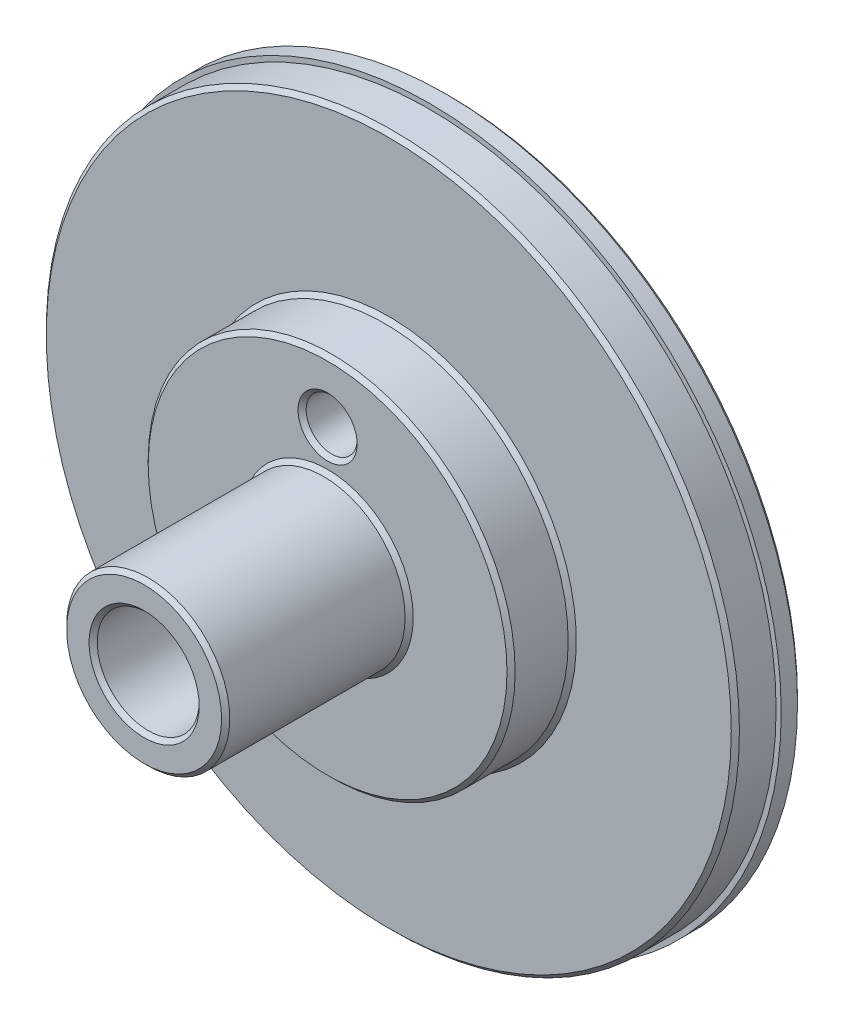
ISO-10303-21;
HEADER;
FILE_DESCRIPTION(('STEP AP214'),'2;1');
FILE_NAME('part.step','',(''),(''),'','','');
FILE_SCHEMA(('AUTOMOTIVE_DESIGN { 1 0 10303 214 1 1 1 1 }'));
ENDSEC;
DATA;
#1=APPLICATION_CONTEXT('core data for automotive mechanical design processes');
#2=APPLICATION_PROTOCOL_DEFINITION('international standard','automotive_design',2000,#1);
#3=PRODUCT_CONTEXT('',#1,'mechanical');
#4=PRODUCT('Part','Part','',(#3));
#5=PRODUCT_RELATED_PRODUCT_CATEGORY('part','',(#4));
#6=PRODUCT_DEFINITION_FORMATION('','',#4);
#7=PRODUCT_DEFINITION_CONTEXT('part definition',#1,'design');
#8=PRODUCT_DEFINITION('design','',#6,#7);
#9=PRODUCT_DEFINITION_SHAPE('','',#8);
#10=(LENGTH_UNIT() NAMED_UNIT(*) SI_UNIT(.MILLI.,.METRE.));
#11=(NAMED_UNIT(*) PLANE_ANGLE_UNIT() SI_UNIT($,.RADIAN.));
#12=(NAMED_UNIT(*) SI_UNIT($,.STERADIAN.) SOLID_ANGLE_UNIT());
#13=UNCERTAINTY_MEASURE_WITH_UNIT(LENGTH_MEASURE(1.E-05),#10,'distance_accuracy_value','');
#14=(GEOMETRIC_REPRESENTATION_CONTEXT(3) GLOBAL_UNCERTAINTY_ASSIGNED_CONTEXT((#13)) GLOBAL_UNIT_ASSIGNED_CONTEXT((#10,
#11,#12)) REPRESENTATION_CONTEXT('',''));
#15=CARTESIAN_POINT('',(0.,0.,0.));
#16=DIRECTION('',(0.,0.,1.));
#17=DIRECTION('',(1.,0.,0.));
#18=AXIS2_PLACEMENT_3D('',#15,#16,#17);
#19=CARTESIAN_POINT('',(0.,0.,1.));
#20=DIRECTION('',(0.,0.,-1.));
#21=DIRECTION('',(-1.,0.,0.));
#22=AXIS2_PLACEMENT_3D('',#19,#20,#21);
#23=CYLINDRICAL_SURFACE('',#22,17.25);
#24=CARTESIAN_POINT('',(0.,0.,0.199999999999992));
#25=DIRECTION('',(0.,0.,1.));
#26=DIRECTION('',(1.,0.,0.));
#27=AXIS2_PLACEMENT_3D('',#24,#25,#26);
#28=CIRCLE('',#27,17.25);
#29=CARTESIAN_POINT('',(17.25,0.,0.199999999999992));
#30=VERTEX_POINT('',#29);
#31=EDGE_CURVE('E126',#30,#30,#28,.T.);
#32=ORIENTED_EDGE('',*,*,#31,.T.);
#33=EDGE_LOOP('',(#32));
#34=FACE_BOUND('',#33,.T.);
#35=CARTESIAN_POINT('',(0.,0.,1.));
#36=DIRECTION('',(0.,0.,1.));
#37=DIRECTION('',(1.,0.,0.));
#38=AXIS2_PLACEMENT_3D('',#35,#36,#37);
#39=CIRCLE('',#38,17.25);
#40=CARTESIAN_POINT('',(17.25,0.,1.));
#41=VERTEX_POINT('',#40);
#42=EDGE_CURVE('E130',#41,#41,#39,.T.);
#43=ORIENTED_EDGE('',*,*,#42,.F.);
#44=EDGE_LOOP('',(#43));
#45=FACE_BOUND('',#44,.T.);
#46=ADVANCED_FACE('F41',(#34,#45),#23,.T.);
#47=CARTESIAN_POINT('',(0.,0.,1.));
#48=DIRECTION('',(0.,0.,1.));
#49=DIRECTION('',(1.,0.,0.));
#50=AXIS2_PLACEMENT_3D('',#47,#48,#49);
#51=PLANE('',#50);
#52=CARTESIAN_POINT('',(0.,0.,1.));
#53=DIRECTION('',(0.,0.,1.));
#54=DIRECTION('',(1.,0.,0.));
#55=AXIS2_PLACEMENT_3D('',#52,#53,#54);
#56=CIRCLE('',#55,17.);
#57=CARTESIAN_POINT('',(17.,0.,1.));
#58=VERTEX_POINT('',#57);
#59=EDGE_CURVE('E134',#58,#58,#56,.T.);
#60=ORIENTED_EDGE('',*,*,#59,.F.);
#61=EDGE_LOOP('',(#60));
#62=FACE_BOUND('',#61,.T.);
#63=ORIENTED_EDGE('',*,*,#42,.T.);
#64=EDGE_LOOP('',(#63));
#65=FACE_BOUND('',#64,.T.);
#66=ADVANCED_FACE('F141',(#62,#65),#51,.T.);
#67=CARTESIAN_POINT('',(0.,0.,0.));
#68=DIRECTION('',(0.,0.,1.));
#69=DIRECTION('',(1.,0.,0.));
#70=AXIS2_PLACEMENT_3D('',#67,#68,#69);
#71=PLANE('',#70);
#72=CARTESIAN_POINT('',(0.,0.,0.));
#73=DIRECTION('',(0.,0.,1.));
#74=DIRECTION('',(1.,0.,0.));
#75=AXIS2_PLACEMENT_3D('',#72,#73,#74);
#76=CIRCLE('',#75,17.05);
#77=CARTESIAN_POINT('',(17.05,0.,0.));
#78=VERTEX_POINT('',#77);
#79=EDGE_CURVE('E114',#78,#78,#76,.F.);
#80=ORIENTED_EDGE('',*,*,#79,.T.);
#81=EDGE_LOOP('',(#80));
#82=FACE_BOUND('',#81,.T.);
#83=CARTESIAN_POINT('',(0.,0.,0.));
#84=DIRECTION('',(0.,0.,1.));
#85=DIRECTION('',(1.,0.,0.));
#86=AXIS2_PLACEMENT_3D('',#83,#84,#85);
#87=CIRCLE('',#86,2.7);
#88=CARTESIAN_POINT('',(2.7,0.,0.));
#89=VERTEX_POINT('',#88);
#90=EDGE_CURVE('E118',#89,#89,#87,.T.);
#91=ORIENTED_EDGE('',*,*,#90,.T.);
#92=EDGE_LOOP('',(#91));
#93=FACE_BOUND('',#92,.T.);
#94=CARTESIAN_POINT('',(0.,6.,0.));
#95=DIRECTION('',(0.,0.,1.));
#96=DIRECTION('',(1.,0.,0.));
#97=AXIS2_PLACEMENT_3D('',#94,#95,#96);
#98=CIRCLE('',#97,1.45000000000001);
#99=CARTESIAN_POINT('',(1.45000000000001,6.,0.));
#100=VERTEX_POINT('',#99);
#101=EDGE_CURVE('E122',#100,#100,#98,.T.);
#102=ORIENTED_EDGE('',*,*,#101,.T.);
#103=EDGE_LOOP('',(#102));
#104=FACE_BOUND('',#103,.T.);
#105=ADVANCED_FACE('F144',(#82,#93,#104),#71,.F.);
#106=CARTESIAN_POINT('',(0.,0.,3.));
#107=DIRECTION('',(0.,0.,-1.));
#108=DIRECTION('',(-1.,0.,0.));
#109=AXIS2_PLACEMENT_3D('',#106,#107,#108);
#110=CYLINDRICAL_SURFACE('',#109,17.);
#111=CARTESIAN_POINT('',(0.,0.,2.8));
#112=DIRECTION('',(0.,0.,1.));
#113=DIRECTION('',(1.,0.,0.));
#114=AXIS2_PLACEMENT_3D('',#111,#112,#113);
#115=CIRCLE('',#114,17.);
#116=CARTESIAN_POINT('',(17.,0.,2.8));
#117=VERTEX_POINT('',#116);
#118=EDGE_CURVE('E86',#117,#117,#115,.F.);
#119=ORIENTED_EDGE('',*,*,#118,.T.);
#120=EDGE_LOOP('',(#119));
#121=FACE_BOUND('',#120,.T.);
#122=ORIENTED_EDGE('',*,*,#59,.T.);
#123=EDGE_LOOP('',(#122));
#124=FACE_BOUND('',#123,.T.);
#125=ADVANCED_FACE('F139',(#121,#124),#110,.T.);
#126=CARTESIAN_POINT('',(0.,0.,3.));
#127=DIRECTION('',(0.,0.,1.));
#128=DIRECTION('',(1.,0.,0.));
#129=AXIS2_PLACEMENT_3D('',#126,#127,#128);
#130=PLANE('',#129);
#131=CARTESIAN_POINT('',(0.,0.,3.));
#132=DIRECTION('',(0.,0.,1.));
#133=DIRECTION('',(1.,0.,0.));
#134=AXIS2_PLACEMENT_3D('',#131,#132,#133);
#135=CIRCLE('',#134,16.8);
#136=CARTESIAN_POINT('',(16.8,0.,3.));
#137=VERTEX_POINT('',#136);
#138=EDGE_CURVE('E90',#137,#137,#135,.T.);
#139=ORIENTED_EDGE('',*,*,#138,.T.);
#140=EDGE_LOOP('',(#139));
#141=FACE_BOUND('',#140,.T.);
#142=CARTESIAN_POINT('',(0.,0.,3.));
#143=DIRECTION('',(0.,0.,1.));
#144=DIRECTION('',(1.,0.,0.));
#145=AXIS2_PLACEMENT_3D('',#142,#143,#144);
#146=CIRCLE('',#145,9.19999999999999);
#147=CARTESIAN_POINT('',(-9.19999999999999,0.,3.));
#148=VERTEX_POINT('',#147);
#149=EDGE_CURVE('E94',#148,#148,#146,.F.);
#150=ORIENTED_EDGE('',*,*,#149,.T.);
#151=EDGE_LOOP('',(#150));
#152=FACE_BOUND('',#151,.T.);
#153=ADVANCED_FACE('F245',(#141,#152),#130,.T.);
#154=CARTESIAN_POINT('',(0.,0.,6.));
#155=DIRECTION('',(0.,0.,-1.));
#156=DIRECTION('',(-1.,0.,0.));
#157=AXIS2_PLACEMENT_3D('',#154,#155,#156);
#158=CYLINDRICAL_SURFACE('',#157,9.);
#159=CARTESIAN_POINT('',(0.,0.,3.19999999999999));
#160=DIRECTION('',(0.,0.,1.));
#161=DIRECTION('',(1.,0.,0.));
#162=AXIS2_PLACEMENT_3D('',#159,#160,#161);
#163=CIRCLE('',#162,9.);
#164=CARTESIAN_POINT('',(-9.,0.,3.19999999999999));
#165=VERTEX_POINT('',#164);
#166=EDGE_CURVE('E78',#165,#165,#163,.T.);
#167=ORIENTED_EDGE('',*,*,#166,.T.);
#168=EDGE_LOOP('',(#167));
#169=FACE_BOUND('',#168,.T.);
#170=CARTESIAN_POINT('',(0.,0.,5.79999999999999));
#171=DIRECTION('',(0.,0.,1.));
#172=DIRECTION('',(1.,0.,0.));
#173=AXIS2_PLACEMENT_3D('',#170,#171,#172);
#174=CIRCLE('',#173,9.);
#175=CARTESIAN_POINT('',(9.,0.,5.79999999999999));
#176=VERTEX_POINT('',#175);
#177=EDGE_CURVE('E82',#176,#176,#174,.F.);
#178=ORIENTED_EDGE('',*,*,#177,.T.);
#179=EDGE_LOOP('',(#178));
#180=FACE_BOUND('',#179,.T.);
#181=ADVANCED_FACE('F241',(#169,#180),#158,.T.);
#182=CARTESIAN_POINT('',(0.,0.,6.));
#183=DIRECTION('',(0.,0.,1.));
#184=DIRECTION('',(1.,0.,0.));
#185=AXIS2_PLACEMENT_3D('',#182,#183,#184);
#186=PLANE('',#185);
#187=CARTESIAN_POINT('',(0.,0.,6.));
#188=DIRECTION('',(0.,0.,1.));
#189=DIRECTION('',(1.,0.,0.));
#190=AXIS2_PLACEMENT_3D('',#187,#188,#189);
#191=CIRCLE('',#190,8.8);
#192=CARTESIAN_POINT('',(8.8,0.,6.));
#193=VERTEX_POINT('',#192);
#194=EDGE_CURVE('E66',#193,#193,#191,.T.);
#195=ORIENTED_EDGE('',*,*,#194,.T.);
#196=EDGE_LOOP('',(#195));
#197=FACE_BOUND('',#196,.T.);
#198=CARTESIAN_POINT('',(0.,0.,6.));
#199=DIRECTION('',(0.,0.,1.));
#200=DIRECTION('',(1.,0.,0.));
#201=AXIS2_PLACEMENT_3D('',#198,#199,#200);
#202=CIRCLE('',#201,4.19999999999999);
#203=CARTESIAN_POINT('',(4.19999999999999,0.,6.));
#204=VERTEX_POINT('',#203);
#205=EDGE_CURVE('E70',#204,#204,#202,.F.);
#206=ORIENTED_EDGE('',*,*,#205,.T.);
#207=EDGE_LOOP('',(#206));
#208=FACE_BOUND('',#207,.T.);
#209=CARTESIAN_POINT('',(0.,6.,6.));
#210=DIRECTION('',(0.,0.,1.));
#211=DIRECTION('',(1.,0.,0.));
#212=AXIS2_PLACEMENT_3D('',#209,#210,#211);
#213=CIRCLE('',#212,1.45);
#214=CARTESIAN_POINT('',(1.45,6.,6.));
#215=VERTEX_POINT('',#214);
#216=EDGE_CURVE('E74',#215,#215,#213,.F.);
#217=ORIENTED_EDGE('',*,*,#216,.T.);
#218=EDGE_LOOP('',(#217));
#219=FACE_BOUND('',#218,.T.);
#220=ADVANCED_FACE('F236',(#197,#208,#219),#186,.T.);
#221=CARTESIAN_POINT('',(0.,0.,15.));
#222=DIRECTION('',(0.,0.,1.));
#223=DIRECTION('',(1.,0.,0.));
#224=AXIS2_PLACEMENT_3D('',#221,#222,#223);
#225=PLANE('',#224);
#226=CARTESIAN_POINT('',(0.,0.,15.));
#227=DIRECTION('',(0.,0.,1.));
#228=DIRECTION('',(1.,0.,0.));
#229=AXIS2_PLACEMENT_3D('',#226,#227,#228);
#230=CIRCLE('',#229,3.8);
#231=CARTESIAN_POINT('',(3.8,0.,15.));
#232=VERTEX_POINT('',#231);
#233=EDGE_CURVE('E10',#232,#232,#230,.T.);
#234=ORIENTED_EDGE('',*,*,#233,.T.);
#235=EDGE_LOOP('',(#234));
#236=FACE_BOUND('',#235,.T.);
#237=CARTESIAN_POINT('',(0.,0.,15.));
#238=DIRECTION('',(0.,0.,1.));
#239=DIRECTION('',(1.,0.,0.));
#240=AXIS2_PLACEMENT_3D('',#237,#238,#239);
#241=CIRCLE('',#240,2.69999999999999);
#242=CARTESIAN_POINT('',(2.69999999999999,0.,15.));
#243=VERTEX_POINT('',#242);
#244=EDGE_CURVE('E50',#243,#243,#241,.F.);
#245=ORIENTED_EDGE('',*,*,#244,.T.);
#246=EDGE_LOOP('',(#245));
#247=FACE_BOUND('',#246,.T.);
#248=ADVANCED_FACE('F227',(#236,#247),#225,.T.);
#249=CARTESIAN_POINT('',(0.,0.,15.));
#250=DIRECTION('',(0.,0.,-1.));
#251=DIRECTION('',(-1.,0.,0.));
#252=AXIS2_PLACEMENT_3D('',#249,#250,#251);
#253=CYLINDRICAL_SURFACE('',#252,4.);
#254=CARTESIAN_POINT('',(0.,0.,6.2));
#255=DIRECTION('',(0.,0.,1.));
#256=DIRECTION('',(1.,0.,0.));
#257=AXIS2_PLACEMENT_3D('',#254,#255,#256);
#258=CIRCLE('',#257,4.);
#259=CARTESIAN_POINT('',(4.,0.,6.2));
#260=VERTEX_POINT('',#259);
#261=EDGE_CURVE('E55',#260,#260,#258,.T.);
#262=ORIENTED_EDGE('',*,*,#261,.T.);
#263=EDGE_LOOP('',(#262));
#264=FACE_BOUND('',#263,.T.);
#265=CARTESIAN_POINT('',(0.,0.,14.8));
#266=DIRECTION('',(0.,0.,1.));
#267=DIRECTION('',(1.,0.,0.));
#268=AXIS2_PLACEMENT_3D('',#265,#266,#267);
#269=CIRCLE('',#268,4.);
#270=CARTESIAN_POINT('',(4.,0.,14.8));
#271=VERTEX_POINT('',#270);
#272=EDGE_CURVE('E60',#271,#271,#269,.F.);
#273=ORIENTED_EDGE('',*,*,#272,.T.);
#274=EDGE_LOOP('',(#273));
#275=FACE_BOUND('',#274,.T.);
#276=ADVANCED_FACE('F224',(#264,#275),#253,.T.);
#277=CARTESIAN_POINT('',(0.,0.,-7.07106781186548));
#278=DIRECTION('',(0.,0.,1.));
#279=DIRECTION('',(1.,0.,0.));
#280=AXIS2_PLACEMENT_3D('',#277,#278,#279);
#281=CYLINDRICAL_SURFACE('',#280,2.5);
#282=CARTESIAN_POINT('',(0.,0.,0.200000000000002));
#283=DIRECTION('',(0.,0.,1.));
#284=DIRECTION('',(1.,0.,0.));
#285=AXIS2_PLACEMENT_3D('',#282,#283,#284);
#286=CIRCLE('',#285,2.5);
#287=CARTESIAN_POINT('',(2.5,0.,0.200000000000002));
#288=VERTEX_POINT('',#287);
#289=EDGE_CURVE('E106',#288,#288,#286,.F.);
#290=ORIENTED_EDGE('',*,*,#289,.T.);
#291=EDGE_LOOP('',(#290));
#292=FACE_BOUND('',#291,.T.);
#293=CARTESIAN_POINT('',(0.,0.,14.8));
#294=DIRECTION('',(0.,0.,1.));
#295=DIRECTION('',(1.,0.,0.));
#296=AXIS2_PLACEMENT_3D('',#293,#294,#295);
#297=CIRCLE('',#296,2.5);
#298=CARTESIAN_POINT('',(2.5,0.,14.8));
#299=VERTEX_POINT('',#298);
#300=EDGE_CURVE('E110',#299,#299,#297,.T.);
#301=ORIENTED_EDGE('',*,*,#300,.T.);
#302=EDGE_LOOP('',(#301));
#303=FACE_BOUND('',#302,.T.);
#304=ADVANCED_FACE('F226',(#292,#303),#281,.F.);
#305=CARTESIAN_POINT('',(0.,6.,0.));
#306=DIRECTION('',(0.,0.,1.));
#307=DIRECTION('',(1.,0.,0.));
#308=AXIS2_PLACEMENT_3D('',#305,#306,#307);
#309=CYLINDRICAL_SURFACE('',#308,1.25);
#310=CARTESIAN_POINT('',(0.,6.,0.200000000000003));
#311=DIRECTION('',(0.,0.,1.));
#312=DIRECTION('',(1.,0.,0.));
#313=AXIS2_PLACEMENT_3D('',#310,#311,#312);
#314=CIRCLE('',#313,1.25);
#315=CARTESIAN_POINT('',(1.25,6.,0.200000000000003));
#316=VERTEX_POINT('',#315);
#317=EDGE_CURVE('E98',#316,#316,#314,.F.);
#318=ORIENTED_EDGE('',*,*,#317,.T.);
#319=EDGE_LOOP('',(#318));
#320=FACE_BOUND('',#319,.T.);
#321=CARTESIAN_POINT('',(0.,6.,5.8));
#322=DIRECTION('',(0.,0.,1.));
#323=DIRECTION('',(1.,0.,0.));
#324=AXIS2_PLACEMENT_3D('',#321,#322,#323);
#325=CIRCLE('',#324,1.25);
#326=CARTESIAN_POINT('',(1.25,6.,5.8));
#327=VERTEX_POINT('',#326);
#328=EDGE_CURVE('E102',#327,#327,#325,.T.);
#329=ORIENTED_EDGE('',*,*,#328,.T.);
#330=EDGE_LOOP('',(#329));
#331=FACE_BOUND('',#330,.T.);
#332=ADVANCED_FACE('F163',(#320,#331),#309,.F.);
#333=CARTESIAN_POINT('',(0.,0.,0.199999999999992));
#334=DIRECTION('',(0.,0.,1.));
#335=DIRECTION('',(1.,0.,0.));
#336=AXIS2_PLACEMENT_3D('',#333,#334,#335);
#337=CONICAL_SURFACE('',#336,17.25,0.785398163397457);
#338=ORIENTED_EDGE('',*,*,#79,.F.);
#339=EDGE_LOOP('',(#338));
#340=FACE_BOUND('',#339,.T.);
#341=ORIENTED_EDGE('',*,*,#31,.F.);
#342=EDGE_LOOP('',(#341));
#343=FACE_BOUND('',#342,.T.);
#344=ADVANCED_FACE('F156',(#340,#343),#337,.T.);
#345=CARTESIAN_POINT('',(0.,0.,0.200000000000002));
#346=DIRECTION('',(0.,0.,-1.));
#347=DIRECTION('',(-1.,0.,0.));
#348=AXIS2_PLACEMENT_3D('',#345,#346,#347);
#349=CONICAL_SURFACE('',#348,2.5,0.785398163397445);
#350=ORIENTED_EDGE('',*,*,#90,.F.);
#351=EDGE_LOOP('',(#350));
#352=FACE_BOUND('',#351,.T.);
#353=ORIENTED_EDGE('',*,*,#289,.F.);
#354=EDGE_LOOP('',(#353));
#355=FACE_BOUND('',#354,.T.);
#356=ADVANCED_FACE('F162',(#352,#355),#349,.F.);
#357=CARTESIAN_POINT('',(0.,6.,0.));
#358=DIRECTION('',(0.,0.,-1.));
#359=DIRECTION('',(-1.,0.,0.));
#360=AXIS2_PLACEMENT_3D('',#357,#358,#359);
#361=CONICAL_SURFACE('',#360,1.45000000000001,0.785398163397458);
#362=ORIENTED_EDGE('',*,*,#317,.F.);
#363=EDGE_LOOP('',(#362));
#364=FACE_BOUND('',#363,.T.);
#365=ORIENTED_EDGE('',*,*,#101,.F.);
#366=EDGE_LOOP('',(#365));
#367=FACE_BOUND('',#366,.T.);
#368=ADVANCED_FACE('F170',(#364,#367),#361,.F.);
#369=CARTESIAN_POINT('',(0.,0.,3.));
#370=DIRECTION('',(0.,0.,-1.));
#371=DIRECTION('',(-1.,0.,0.));
#372=AXIS2_PLACEMENT_3D('',#369,#370,#371);
#373=CONICAL_SURFACE('',#372,16.8,0.78539816339744);
#374=ORIENTED_EDGE('',*,*,#118,.F.);
#375=EDGE_LOOP('',(#374));
#376=FACE_BOUND('',#375,.T.);
#377=ORIENTED_EDGE('',*,*,#138,.F.);
#378=EDGE_LOOP('',(#377));
#379=FACE_BOUND('',#378,.T.);
#380=ADVANCED_FACE('F177',(#376,#379),#373,.T.);
#381=CARTESIAN_POINT('',(0.,0.,3.19999999999999));
#382=DIRECTION('',(0.,0.,-1.));
#383=DIRECTION('',(-1.,0.,0.));
#384=AXIS2_PLACEMENT_3D('',#381,#382,#383);
#385=CONICAL_SURFACE('',#384,9.,0.785398163397431);
#386=CARTESIAN_POINT('',(-9.19999999999999,0.,3.));
#387=CARTESIAN_POINT('',(-9.19791666666665,0.,3.00208333333333));
#388=CARTESIAN_POINT('',(-9.19583333333332,0.,3.00416666666667));
#389=CARTESIAN_POINT('',(-9.19166666666665,0.,3.00833333333333));
#390=CARTESIAN_POINT('',(-9.18958333333332,0.,3.01041666666667));
#391=CARTESIAN_POINT('',(-9.18541666666665,0.,3.01458333333333));
#392=CARTESIAN_POINT('',(-9.18333333333332,0.,3.01666666666667));
#393=CARTESIAN_POINT('',(-9.17916666666665,0.,3.02083333333333));
#394=CARTESIAN_POINT('',(-9.17708333333332,0.,3.02291666666667));
#395=CARTESIAN_POINT('',(-9.17291666666666,0.,3.02708333333333));
#396=CARTESIAN_POINT('',(-9.17083333333332,0.,3.02916666666667));
#397=CARTESIAN_POINT('',(-9.16666666666666,0.,3.03333333333333));
#398=CARTESIAN_POINT('',(-9.16458333333332,0.,3.03541666666667));
#399=CARTESIAN_POINT('',(-9.16041666666666,0.,3.03958333333333));
#400=CARTESIAN_POINT('',(-9.15833333333332,0.,3.04166666666667));
#401=CARTESIAN_POINT('',(-9.15416666666666,0.,3.04583333333333));
#402=CARTESIAN_POINT('',(-9.15208333333332,0.,3.04791666666666));
#403=CARTESIAN_POINT('',(-9.14791666666666,0.,3.05208333333333));
#404=CARTESIAN_POINT('',(-9.14583333333332,0.,3.05416666666666));
#405=CARTESIAN_POINT('',(-9.14166666666666,0.,3.05833333333333));
#406=CARTESIAN_POINT('',(-9.13958333333332,0.,3.06041666666667));
#407=CARTESIAN_POINT('',(-9.13541666666666,0.,3.06458333333333));
#408=CARTESIAN_POINT('',(-9.13333333333332,0.,3.06666666666666));
#409=CARTESIAN_POINT('',(-9.12916666666666,0.,3.07083333333333));
#410=CARTESIAN_POINT('',(-9.12708333333332,0.,3.07291666666666));
#411=CARTESIAN_POINT('',(-9.12291666666666,0.,3.07708333333333));
#412=CARTESIAN_POINT('',(-9.12083333333332,0.,3.07916666666666));
#413=CARTESIAN_POINT('',(-9.11666666666666,0.,3.08333333333333));
#414=CARTESIAN_POINT('',(-9.11458333333333,0.,3.08541666666666));
#415=CARTESIAN_POINT('',(-9.11041666666666,0.,3.08958333333333));
#416=CARTESIAN_POINT('',(-9.10833333333333,0.,3.09166666666666));
#417=CARTESIAN_POINT('',(-9.10416666666666,0.,3.09583333333333));
#418=CARTESIAN_POINT('',(-9.10208333333333,0.,3.09791666666666));
#419=CARTESIAN_POINT('',(-9.09791666666666,0.,3.10208333333333));
#420=CARTESIAN_POINT('',(-9.09583333333333,0.,3.10416666666666));
#421=CARTESIAN_POINT('',(-9.09166666666666,0.,3.10833333333333));
#422=CARTESIAN_POINT('',(-9.08958333333333,0.,3.11041666666666));
#423=CARTESIAN_POINT('',(-9.08541666666666,0.,3.11458333333333));
#424=CARTESIAN_POINT('',(-9.08333333333333,0.,3.11666666666666));
#425=CARTESIAN_POINT('',(-9.07916666666666,0.,3.12083333333333));
#426=CARTESIAN_POINT('',(-9.07708333333333,0.,3.12291666666666));
#427=CARTESIAN_POINT('',(-9.07291666666666,0.,3.12708333333333));
#428=CARTESIAN_POINT('',(-9.07083333333333,0.,3.12916666666666));
#429=CARTESIAN_POINT('',(-9.06666666666666,0.,3.13333333333333));
#430=CARTESIAN_POINT('',(-9.06458333333333,0.,3.13541666666666));
#431=CARTESIAN_POINT('',(-9.06041666666666,0.,3.13958333333333));
#432=CARTESIAN_POINT('',(-9.05833333333333,0.,3.14166666666666));
#433=CARTESIAN_POINT('',(-9.05416666666666,0.,3.14583333333333));
#434=CARTESIAN_POINT('',(-9.05208333333333,0.,3.14791666666666));
#435=CARTESIAN_POINT('',(-9.04791666666666,0.,3.15208333333333));
#436=CARTESIAN_POINT('',(-9.04583333333333,0.,3.15416666666666));
#437=CARTESIAN_POINT('',(-9.04166666666666,0.,3.15833333333333));
#438=CARTESIAN_POINT('',(-9.03958333333333,0.,3.16041666666666));
#439=CARTESIAN_POINT('',(-9.03541666666666,0.,3.16458333333333));
#440=CARTESIAN_POINT('',(-9.03333333333333,0.,3.16666666666666));
#441=CARTESIAN_POINT('',(-9.02916666666667,0.,3.17083333333333));
#442=CARTESIAN_POINT('',(-9.02708333333333,0.,3.17291666666666));
#443=CARTESIAN_POINT('',(-9.02291666666667,0.,3.17708333333333));
#444=CARTESIAN_POINT('',(-9.02083333333333,0.,3.17916666666666));
#445=CARTESIAN_POINT('',(-9.01666666666667,0.,3.18333333333333));
#446=CARTESIAN_POINT('',(-9.01458333333333,0.,3.18541666666666));
#447=CARTESIAN_POINT('',(-9.01041666666666,0.,3.18958333333333));
#448=CARTESIAN_POINT('',(-9.00833333333333,0.,3.19166666666666));
#449=CARTESIAN_POINT('',(-9.00416666666666,0.,3.19583333333333));
#450=CARTESIAN_POINT('',(-9.00208333333333,0.,3.19791666666666));
#451=CARTESIAN_POINT('',(-9.,0.,3.19999999999999));
#452=B_SPLINE_CURVE_WITH_KNOTS('',3,(#386,#387,#388,#389,#390,#391,#392,#393,#394,#395,#396,
#397,#398,#399,#400,#401,#402,#403,#404,#405,#406,#407,#408,#409,#410,#411,#412,#413,#414,#415,
#416,#417,#418,#419,#420,#421,#422,#423,#424,#425,#426,#427,#428,#429,#430,#431,#432,#433,#434,
#435,#436,#437,#438,#439,#440,#441,#442,#443,#444,#445,#446,#447,#448,#449,#450,#451),
.UNSPECIFIED.,.F.,.F.,(4,2,2,2,2,2,2,2,2,2,2,2,2,2,2,2,2,2,2,2,2,2,2,2,2,2,2,2,2,2,2,2,4),(0.,
0.00883883476483148,0.0176776695296627,0.0265165042944938,0.035355339059325,0.0441941738241574,
0.0530330085889886,0.0618718433538198,0.070710678118651,0.0795495128834824,0.0883883476483136,
0.097227182413146,0.106066017177977,0.114904851942808,0.12374368670764,0.132582521472471,
0.141421356237302,0.150260191002135,0.159099025766966,0.167937860531797,0.176776695296628,
0.185615530061459,0.19445436482629,0.203293199591122,0.212132034355954,0.220970869120786,
0.229809703885617,0.238648538650448,0.247487373415279,0.25632620818011,0.265165042944943,
0.274003877709774,0.282842712474605),.UNSPECIFIED.);
#453=EDGE_CURVE('BSEAM184',#148,#165,#452,.T.);
#454=ORIENTED_EDGE('',*,*,#149,.F.);
#455=ORIENTED_EDGE('',*,*,#166,.F.);
#456=ORIENTED_EDGE('',*,*,#453,.T.);
#457=ORIENTED_EDGE('',*,*,#453,.F.);
#458=EDGE_LOOP('',(#454,#456,#455,#457));
#459=FACE_BOUND('',#458,.T.);
#460=ADVANCED_FACE('F184',(#459),#385,.T.);
#461=CARTESIAN_POINT('',(0.,0.,6.));
#462=DIRECTION('',(0.,0.,-1.));
#463=DIRECTION('',(-1.,0.,0.));
#464=AXIS2_PLACEMENT_3D('',#461,#462,#463);
#465=CONICAL_SURFACE('',#464,8.8,0.78539816339744);
#466=ORIENTED_EDGE('',*,*,#177,.F.);
#467=EDGE_LOOP('',(#466));
#468=FACE_BOUND('',#467,.T.);
#469=ORIENTED_EDGE('',*,*,#194,.F.);
#470=EDGE_LOOP('',(#469));
#471=FACE_BOUND('',#470,.T.);
#472=ADVANCED_FACE('F191',(#468,#471),#465,.T.);
#473=CARTESIAN_POINT('',(0.,0.,6.2));
#474=DIRECTION('',(0.,0.,-1.));
#475=DIRECTION('',(-1.,0.,0.));
#476=AXIS2_PLACEMENT_3D('',#473,#474,#475);
#477=CONICAL_SURFACE('',#476,4.,0.785398163397418);
#478=ORIENTED_EDGE('',*,*,#205,.F.);
#479=EDGE_LOOP('',(#478));
#480=FACE_BOUND('',#479,.T.);
#481=ORIENTED_EDGE('',*,*,#261,.F.);
#482=EDGE_LOOP('',(#481));
#483=FACE_BOUND('',#482,.T.);
#484=ADVANCED_FACE('F198',(#480,#483),#477,.T.);
#485=CARTESIAN_POINT('',(0.,6.,5.8));
#486=DIRECTION('',(0.,0.,1.));
#487=DIRECTION('',(1.,0.,0.));
#488=AXIS2_PLACEMENT_3D('',#485,#486,#487);
#489=CONICAL_SURFACE('',#488,1.25,0.785398163397448);
#490=CARTESIAN_POINT('',(1.45,6.,6.));
#491=CARTESIAN_POINT('',(1.44791666666667,6.,5.99791666666667));
#492=CARTESIAN_POINT('',(1.44583333333333,6.,5.99583333333333));
#493=CARTESIAN_POINT('',(1.44166666666667,6.,5.99166666666667));
#494=CARTESIAN_POINT('',(1.43958333333333,6.,5.98958333333333));
#495=CARTESIAN_POINT('',(1.43541666666667,6.,5.98541666666667));
#496=CARTESIAN_POINT('',(1.43333333333333,6.,5.98333333333333));
#497=CARTESIAN_POINT('',(1.42916666666667,6.,5.97916666666667));
#498=CARTESIAN_POINT('',(1.42708333333333,6.,5.97708333333333));
#499=CARTESIAN_POINT('',(1.42291666666667,6.,5.97291666666667));
#500=CARTESIAN_POINT('',(1.42083333333333,6.,5.97083333333333));
#501=CARTESIAN_POINT('',(1.41666666666667,6.,5.96666666666667));
#502=CARTESIAN_POINT('',(1.41458333333333,6.,5.96458333333333));
#503=CARTESIAN_POINT('',(1.41041666666667,6.,5.96041666666667));
#504=CARTESIAN_POINT('',(1.40833333333333,6.,5.95833333333333));
#505=CARTESIAN_POINT('',(1.40416666666667,6.,5.95416666666667));
#506=CARTESIAN_POINT('',(1.40208333333333,6.,5.95208333333333));
#507=CARTESIAN_POINT('',(1.39791666666667,6.,5.94791666666667));
#508=CARTESIAN_POINT('',(1.39583333333333,6.,5.94583333333333));
#509=CARTESIAN_POINT('',(1.39166666666667,6.,5.94166666666667));
#510=CARTESIAN_POINT('',(1.38958333333333,6.,5.93958333333333));
#511=CARTESIAN_POINT('',(1.38541666666667,6.,5.93541666666667));
#512=CARTESIAN_POINT('',(1.38333333333333,6.,5.93333333333333));
#513=CARTESIAN_POINT('',(1.37916666666667,6.,5.92916666666667));
#514=CARTESIAN_POINT('',(1.37708333333333,6.,5.92708333333333));
#515=CARTESIAN_POINT('',(1.37291666666667,6.,5.92291666666667));
#516=CARTESIAN_POINT('',(1.37083333333333,6.,5.92083333333333));
#517=CARTESIAN_POINT('',(1.36666666666667,6.,5.91666666666667));
#518=CARTESIAN_POINT('',(1.36458333333333,6.,5.91458333333333));
#519=CARTESIAN_POINT('',(1.36041666666667,6.,5.91041666666667));
#520=CARTESIAN_POINT('',(1.35833333333333,6.,5.90833333333333));
#521=CARTESIAN_POINT('',(1.35416666666667,6.,5.90416666666667));
#522=CARTESIAN_POINT('',(1.35208333333333,6.,5.90208333333333));
#523=CARTESIAN_POINT('',(1.34791666666667,6.,5.89791666666667));
#524=CARTESIAN_POINT('',(1.34583333333333,6.,5.89583333333333));
#525=CARTESIAN_POINT('',(1.34166666666667,6.,5.89166666666667));
#526=CARTESIAN_POINT('',(1.33958333333333,6.,5.88958333333333));
#527=CARTESIAN_POINT('',(1.33541666666667,6.,5.88541666666667));
#528=CARTESIAN_POINT('',(1.33333333333333,6.,5.88333333333333));
#529=CARTESIAN_POINT('',(1.32916666666667,6.,5.87916666666667));
#530=CARTESIAN_POINT('',(1.32708333333333,6.,5.87708333333333));
#531=CARTESIAN_POINT('',(1.32291666666667,6.,5.87291666666667));
#532=CARTESIAN_POINT('',(1.32083333333333,6.,5.87083333333333));
#533=CARTESIAN_POINT('',(1.31666666666667,6.,5.86666666666667));
#534=CARTESIAN_POINT('',(1.31458333333333,6.,5.86458333333333));
#535=CARTESIAN_POINT('',(1.31041666666667,6.,5.86041666666667));
#536=CARTESIAN_POINT('',(1.30833333333333,6.,5.85833333333333));
#537=CARTESIAN_POINT('',(1.30416666666667,6.,5.85416666666667));
#538=CARTESIAN_POINT('',(1.30208333333333,6.,5.85208333333333));
#539=CARTESIAN_POINT('',(1.29791666666667,6.,5.84791666666667));
#540=CARTESIAN_POINT('',(1.29583333333333,6.,5.84583333333333));
#541=CARTESIAN_POINT('',(1.29166666666667,6.,5.84166666666667));
#542=CARTESIAN_POINT('',(1.28958333333333,6.,5.83958333333333));
#543=CARTESIAN_POINT('',(1.28541666666667,6.,5.83541666666667));
#544=CARTESIAN_POINT('',(1.28333333333333,6.,5.83333333333333));
#545=CARTESIAN_POINT('',(1.27916666666667,6.,5.82916666666667));
#546=CARTESIAN_POINT('',(1.27708333333333,6.,5.82708333333333));
#547=CARTESIAN_POINT('',(1.27291666666667,6.,5.82291666666667));
#548=CARTESIAN_POINT('',(1.27083333333333,6.,5.82083333333333));
#549=CARTESIAN_POINT('',(1.26666666666667,6.,5.81666666666667));
#550=CARTESIAN_POINT('',(1.26458333333333,6.,5.81458333333333));
#551=CARTESIAN_POINT('',(1.26041666666667,6.,5.81041666666667));
#552=CARTESIAN_POINT('',(1.25833333333333,6.,5.80833333333333));
#553=CARTESIAN_POINT('',(1.25416666666667,6.,5.80416666666667));
#554=CARTESIAN_POINT('',(1.25208333333333,6.,5.80208333333333));
#555=CARTESIAN_POINT('',(1.25,6.,5.8));
#556=B_SPLINE_CURVE_WITH_KNOTS('',3,(#490,#491,#492,#493,#494,#495,#496,#497,#498,#499,#500,
#501,#502,#503,#504,#505,#506,#507,#508,#509,#510,#511,#512,#513,#514,#515,#516,#517,#518,#519,
#520,#521,#522,#523,#524,#525,#526,#527,#528,#529,#530,#531,#532,#533,#534,#535,#536,#537,#538,
#539,#540,#541,#542,#543,#544,#545,#546,#547,#548,#549,#550,#551,#552,#553,#554,#555),
.UNSPECIFIED.,.F.,.F.,(4,2,2,2,2,2,2,2,2,2,2,2,2,2,2,2,2,2,2,2,2,2,2,2,2,2,2,2,2,2,2,2,4),(0.,
0.00883883476483133,0.0176776695296633,0.0265165042944952,0.0353553390593272,0.0441941738241586,
0.0530330085889906,0.0618718433538225,0.0707106781186545,0.0795495128834864,0.0883883476483177,
0.0972271824131497,0.106066017177982,0.114904851942814,0.123743686707645,0.132582521472477,
0.141421356237309,0.150260191002141,0.159099025766973,0.167937860531804,0.176776695296636,
0.185615530061468,0.1944543648263,0.203293199591131,0.212132034355963,0.220970869120795,
0.229809703885627,0.238648538650459,0.247487373415291,0.256326208180123,0.265165042944955,
0.274003877709787,0.282842712474618),.UNSPECIFIED.);
#557=EDGE_CURVE('BSEAM205',#215,#327,#556,.T.);
#558=ORIENTED_EDGE('',*,*,#216,.F.);
#559=ORIENTED_EDGE('',*,*,#328,.F.);
#560=ORIENTED_EDGE('',*,*,#557,.T.);
#561=ORIENTED_EDGE('',*,*,#557,.F.);
#562=EDGE_LOOP('',(#558,#560,#559,#561));
#563=FACE_BOUND('',#562,.T.);
#564=ADVANCED_FACE('F205',(#563),#489,.F.);
#565=CARTESIAN_POINT('',(0.,0.,15.));
#566=DIRECTION('',(0.,0.,-1.));
#567=DIRECTION('',(-1.,0.,0.));
#568=AXIS2_PLACEMENT_3D('',#565,#566,#567);
#569=CONICAL_SURFACE('',#568,3.8,0.785398163397448);
#570=ORIENTED_EDGE('',*,*,#272,.F.);
#571=EDGE_LOOP('',(#570));
#572=FACE_BOUND('',#571,.T.);
#573=ORIENTED_EDGE('',*,*,#233,.F.);
#574=EDGE_LOOP('',(#573));
#575=FACE_BOUND('',#574,.T.);
#576=ADVANCED_FACE('F211',(#572,#575),#569,.T.);
#577=CARTESIAN_POINT('',(0.,0.,14.8));
#578=DIRECTION('',(0.,0.,1.));
#579=DIRECTION('',(1.,0.,0.));
#580=AXIS2_PLACEMENT_3D('',#577,#578,#579);
#581=CONICAL_SURFACE('',#580,2.5,0.785398163397436);
#582=ORIENTED_EDGE('',*,*,#244,.F.);
#583=EDGE_LOOP('',(#582));
#584=FACE_BOUND('',#583,.T.);
#585=ORIENTED_EDGE('',*,*,#300,.F.);
#586=EDGE_LOOP('',(#585));
#587=FACE_BOUND('',#586,.T.);
#588=ADVANCED_FACE('F44',(#584,#587),#581,.F.);
#589=CLOSED_SHELL('',(#46,#66,#105,#125,#153,#181,#220,#248,#276,#304,#332,#344,#356,#368,#380,
#460,#472,#484,#564,#576,#588));
#590=MANIFOLD_SOLID_BREP('B2',#589);
#591=ADVANCED_BREP_SHAPE_REPRESENTATION('',(#18,#590),#14);
#592=SHAPE_DEFINITION_REPRESENTATION(#9,#591);
ENDSEC;
END-ISO-10303-21;
